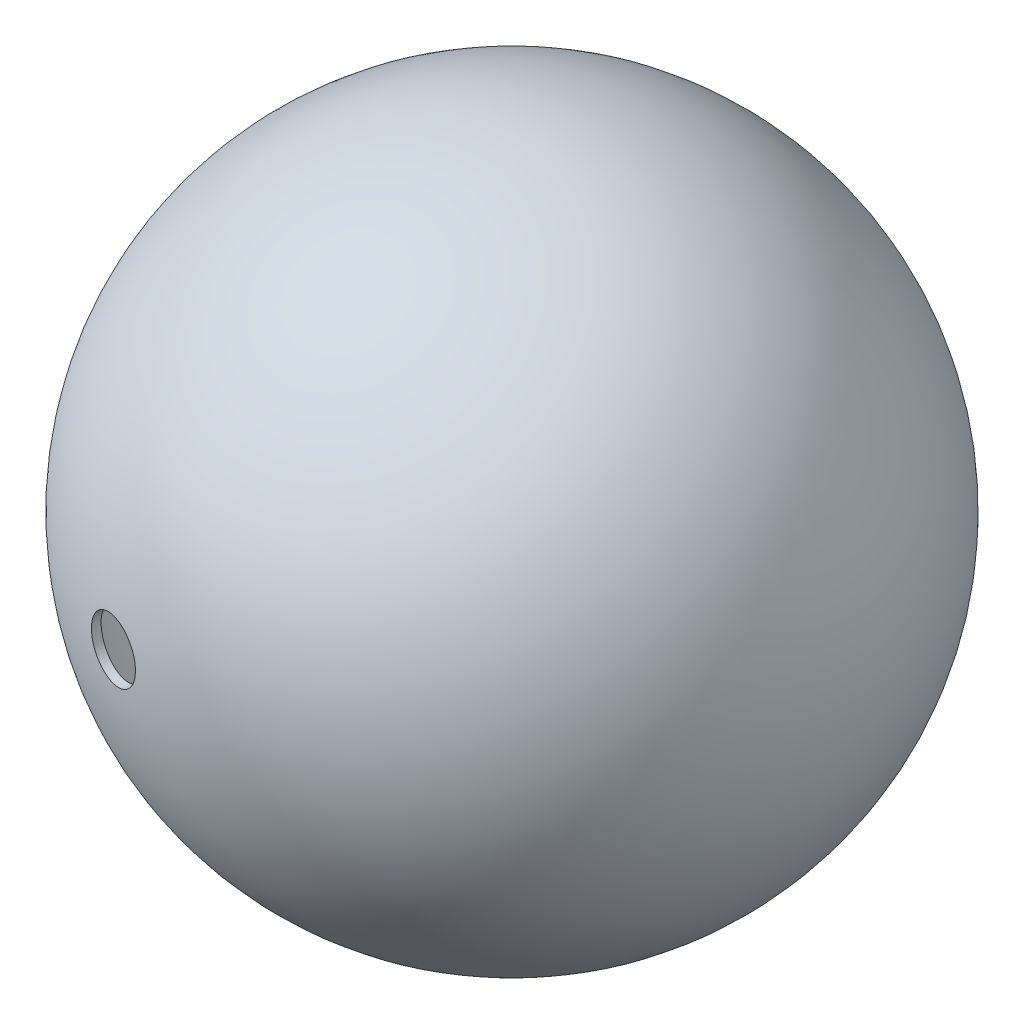
ISO-10303-21;
HEADER;
FILE_DESCRIPTION(('STEP AP214'),'2;1');
FILE_NAME('part.step','',(''),(''),'','','');
FILE_SCHEMA(('AUTOMOTIVE_DESIGN { 1 0 10303 214 1 1 1 1 }'));
ENDSEC;
DATA;
#1=APPLICATION_CONTEXT('core data for automotive mechanical design processes');
#2=APPLICATION_PROTOCOL_DEFINITION('international standard','automotive_design',2000,#1);
#3=PRODUCT_CONTEXT('',#1,'mechanical');
#4=PRODUCT('Part','Part','',(#3));
#5=PRODUCT_RELATED_PRODUCT_CATEGORY('part','',(#4));
#6=PRODUCT_DEFINITION_FORMATION('','',#4);
#7=PRODUCT_DEFINITION_CONTEXT('part definition',#1,'design');
#8=PRODUCT_DEFINITION('design','',#6,#7);
#9=PRODUCT_DEFINITION_SHAPE('','',#8);
#10=(LENGTH_UNIT() NAMED_UNIT(*) SI_UNIT(.MILLI.,.METRE.));
#11=(NAMED_UNIT(*) PLANE_ANGLE_UNIT() SI_UNIT($,.RADIAN.));
#12=(NAMED_UNIT(*) SI_UNIT($,.STERADIAN.) SOLID_ANGLE_UNIT());
#13=UNCERTAINTY_MEASURE_WITH_UNIT(LENGTH_MEASURE(1.E-05),#10,'distance_accuracy_value','');
#14=(GEOMETRIC_REPRESENTATION_CONTEXT(3) GLOBAL_UNCERTAINTY_ASSIGNED_CONTEXT((#13)) GLOBAL_UNIT_ASSIGNED_CONTEXT((#10,
#11,#12)) REPRESENTATION_CONTEXT('',''));
#15=CARTESIAN_POINT('',(0.,0.,0.));
#16=DIRECTION('',(0.,0.,1.));
#17=DIRECTION('',(1.,0.,0.));
#18=AXIS2_PLACEMENT_3D('',#15,#16,#17);
#19=CARTESIAN_POINT('',(0.,0.,0.));
#20=DIRECTION('',(0.,1.,0.));
#21=DIRECTION('',(1.,0.,0.));
#22=AXIS2_PLACEMENT_3D('',#19,#20,#21);
#23=SPHERICAL_SURFACE('',#22,12.33);
#24=CARTESIAN_POINT('',(-3.89423857841952,-0.640575807275164,11.6813299127061));
#25=CARTESIAN_POINT('',(-3.85775168175633,-0.691505855556212,11.6907004718159));
#26=CARTESIAN_POINT('',(-3.81696509159421,-0.739223212932149,11.7011640014424));
#27=CARTESIAN_POINT('',(-3.72811549347727,-0.826894922693143,11.7239215486656));
#28=CARTESIAN_POINT('',(-3.68004101211075,-0.866836803491528,11.7362184520507));
#29=CARTESIAN_POINT('',(-3.57819710896939,-0.937834038809236,11.7622228270749));
#30=CARTESIAN_POINT('',(-3.52443782093705,-0.968904852812223,11.7759277875105));
#31=CARTESIAN_POINT('',(-3.41271713300457,-1.02150731349265,11.8043550893527));
#32=CARTESIAN_POINT('',(-3.35475685131224,-1.04304148783234,11.8190771599794));
#33=CARTESIAN_POINT('',(-3.23492437803613,-1.07645792659961,11.8494552267948));
#34=CARTESIAN_POINT('',(-3.17299487658737,-1.08812275102135,11.8651244962458));
#35=CARTESIAN_POINT('',(-3.04809735110112,-1.1007395624117,11.8966619112228));
#36=CARTESIAN_POINT('',(-2.98512916395858,-1.1016898505239,11.9125300878875));
#37=CARTESIAN_POINT('',(-2.85894917270471,-1.09277803432639,11.9442647516258));
#38=CARTESIAN_POINT('',(-2.79574781632589,-1.08275396486635,11.96012766214));
#39=CARTESIAN_POINT('',(-2.67187161406038,-1.05185862975064,11.9911597111651));
#40=CARTESIAN_POINT('',(-2.61119678222989,-1.03098730375545,12.0063288458163));
#41=CARTESIAN_POINT('',(-2.4944472361188,-0.979019530976722,12.0354654254668));
#42=CARTESIAN_POINT('',(-2.43835175318607,-0.947972868987433,12.0494383116953));
#43=CARTESIAN_POINT('',(-2.33215852169005,-0.876405111618228,12.0758487686261));
#44=CARTESIAN_POINT('',(-2.28206011160448,-0.835885062683024,12.0882865086713));
#45=CARTESIAN_POINT('',(-2.19051068611181,-0.74745383396816,12.110985184453));
#46=CARTESIAN_POINT('',(-2.14889219024592,-0.699726991745772,12.1212883657112));
#47=CARTESIAN_POINT('',(-2.0743040534998,-0.597565732522574,12.1397348007515));
#48=CARTESIAN_POINT('',(-2.04133291737108,-0.543132477549204,12.1478784279533));
#49=CARTESIAN_POINT('',(-1.98600320550661,-0.430828854076708,12.1615346985292));
#50=CARTESIAN_POINT('',(-1.96336075390828,-0.373106866502893,12.167117744494));
#51=CARTESIAN_POINT('',(-1.92806232592623,-0.254510351422112,12.175818049115));
#52=CARTESIAN_POINT('',(-1.91540481518788,-0.19363630981407,12.1789356866231));
#53=CARTESIAN_POINT('',(-1.90069042842959,-0.0719989410932524,12.1825596919018));
#54=CARTESIAN_POINT('',(-1.89839183652547,-0.0112665175828894,12.183125602065));
#55=CARTESIAN_POINT('',(-1.90381222079359,0.109719523717276,12.1817908008469));
#56=CARTESIAN_POINT('',(-1.91153052207379,0.169973173489462,12.1798902556438));
#57=CARTESIAN_POINT('',(-1.93662729615165,0.287820915290548,12.1737071415375));
#58=CARTESIAN_POINT('',(-1.95393183956863,0.3454317515228,12.1694428021302));
#59=CARTESIAN_POINT('',(-1.99758604642471,0.456890520775181,12.1586764300414));
#60=CARTESIAN_POINT('',(-2.02393599979012,0.510738333115102,12.1521743256345));
#61=CARTESIAN_POINT('',(-2.08518808249646,0.613800988661716,12.1370436736015));
#62=CARTESIAN_POINT('',(-2.12018018738811,0.66295901673982,12.1283927482544));
#63=CARTESIAN_POINT('',(-2.19749531071848,0.754709587199057,12.1092534664174));
#64=CARTESIAN_POINT('',(-2.23981913093077,0.79730141055672,12.0987649089684));
#65=CARTESIAN_POINT('',(-2.33169350436811,0.875847118205251,12.0759625649929));
#66=CARTESIAN_POINT('',(-2.3813966112871,0.911611273715355,12.0636101261537));
#67=CARTESIAN_POINT('',(-2.48578246000546,0.974314690876098,12.0376232685963));
#68=CARTESIAN_POINT('',(-2.54046592479811,1.00125266862192,12.0239886637381));
#69=CARTESIAN_POINT('',(-2.65493706198322,1.04633777753928,11.995394432145));
#70=CARTESIAN_POINT('',(-2.714826166912,1.064210506997,11.9804080123852));
#71=CARTESIAN_POINT('',(-2.83662519023071,1.08957781020603,11.9498695396523));
#72=CARTESIAN_POINT('',(-2.89853537209928,1.09707102525228,11.9343174129001));
#73=CARTESIAN_POINT('',(-3.0240109672061,1.1015655112816,11.9027345027742));
#74=CARTESIAN_POINT('',(-3.08758373787051,1.09834201062414,11.8867005446218));
#75=CARTESIAN_POINT('',(-3.21330230247774,1.08098531466911,11.8549288754347));
#76=CARTESIAN_POINT('',(-3.27544801462931,1.06685149565048,11.8391911813895));
#77=CARTESIAN_POINT('',(-3.39678914828294,1.02792707492006,11.8084039193739));
#78=CARTESIAN_POINT('',(-3.45597158942173,1.00309350739992,11.793357399366));
#79=CARTESIAN_POINT('',(-3.56935360770841,0.94336693150768,11.764479887607));
#80=CARTESIAN_POINT('',(-3.62355347135851,0.908474502006026,11.7506488259681));
#81=CARTESIAN_POINT('',(-3.7244656393364,0.830158733273977,11.7248569343794));
#82=CARTESIAN_POINT('',(-3.77128351850179,0.786880233027356,11.7128698085625));
#83=CARTESIAN_POINT('',(-3.85694498529733,0.69260344044194,11.6909089026003));
#84=CARTESIAN_POINT('',(-3.8957898926853,0.641606428172513,11.6809347892478));
#85=CARTESIAN_POINT('',(-3.96316869169015,0.534946377306921,11.6636169741754));
#86=CARTESIAN_POINT('',(-3.9919729189442,0.479465333574898,11.6562043640814));
#87=CARTESIAN_POINT('',(-4.03983487679804,0.364191635903038,11.6438794654926));
#88=CARTESIAN_POINT('',(-4.05889484495732,0.30439997540504,11.6389666029858));
#89=CARTESIAN_POINT('',(-4.08618773235738,0.184091617850248,11.6319295782436));
#90=CARTESIAN_POINT('',(-4.09472192469567,0.123647670689082,11.6297278208508));
#91=CARTESIAN_POINT('',(-4.10167983764615,0.00212712013117659,11.6279328279403));
#92=CARTESIAN_POINT('',(-4.10010198990579,-0.0589495799372979,11.6283399970607));
#93=CARTESIAN_POINT('',(-4.08698674491201,-0.179049488812694,11.631723098003));
#94=CARTESIAN_POINT('',(-4.07559287419262,-0.238089596578929,11.6346620114797));
#95=CARTESIAN_POINT('',(-4.0434245312293,-0.353319949508063,11.6429536562815));
#96=CARTESIAN_POINT('',(-4.02266188735208,-0.409513689101712,11.6483033439182));
#97=CARTESIAN_POINT('',(-3.98311736873325,-0.494632619196736,11.6584822938749));
#98=CARTESIAN_POINT('',(-3.96722259597301,-0.525024790432751,11.6625719301515));
#99=CARTESIAN_POINT('',(-3.93272353188613,-0.584121147319811,11.6714428652333));
#100=CARTESIAN_POINT('',(-3.91411931667609,-0.612825380358452,11.6762241446081));
#101=CARTESIAN_POINT('',(-3.89423857841952,-0.640575807275164,11.6813299127061));
#102=B_SPLINE_CURVE_WITH_KNOTS('',3,(#24,#25,#26,#27,#28,#29,#30,#31,#32,#33,#34,#35,#36,#37,
#38,#39,#40,#41,#42,#43,#44,#45,#46,#47,#48,#49,#50,#51,#52,#53,#54,#55,#56,#57,#58,#59,#60,#61,
#62,#63,#64,#65,#66,#67,#68,#69,#70,#71,#72,#73,#74,#75,#76,#77,#78,#79,#80,#81,#82,#83,#84,#85,
#86,#87,#88,#89,#90,#91,#92,#93,#94,#95,#96,#97,#98,#99,#100,#101),.UNSPECIFIED.,.T.,.F.,(4,2,2,
2,2,2,2,2,2,2,2,2,2,2,2,2,2,2,2,2,2,2,2,2,2,2,2,2,2,2,2,2,2,2,2,2,2,2,4),(0.,0.189913425448115,
0.380128999789478,0.57001103608797,0.759842714467535,0.953755231429849,1.14769849399646,
1.34454313137859,1.54138886375081,1.73728551987691,1.93316054717614,2.1246810849295,
2.31616848425834,2.5020180834332,2.68783911811498,2.86930095235598,3.05075056117062,
3.23081992316923,3.41089505734623,3.59293047056877,3.77498580319878,3.96153346287635,
4.14810824677695,4.34003620855183,4.5319892918157,4.72799357199572,4.92400905817813,
5.12081910746094,5.31761783291959,5.51127977672094,5.70490963796116,5.89282825245518,
6.08070369607811,6.26306658427347,6.44545775718859,6.62522647431475,6.80476886015796,
6.90825053438461,7.01172930205272),.UNSPECIFIED.);
#103=CARTESIAN_POINT('',(-3.89423857841952,-0.640575807275164,11.6813299127061));
#104=VERTEX_POINT('',#103);
#105=EDGE_CURVE('E10',#104,#104,#102,.T.);
#106=ORIENTED_EDGE('',*,*,#105,.F.);
#107=EDGE_LOOP('',(#106));
#108=FACE_BOUND('',#107,.T.);
#109=CARTESIAN_POINT('',(0.,0.,-11.9650387931034));
#110=DIRECTION('',(0.,0.,-1.));
#111=DIRECTION('',(-1.,0.,0.));
#112=AXIS2_PLACEMENT_3D('',#109,#110,#111);
#113=CIRCLE('',#112,2.9777082932231);
#114=CARTESIAN_POINT('',(2.97770829322309,0.,-11.9650387931034));
#115=VERTEX_POINT('',#114);
#116=EDGE_CURVE('E46',#115,#115,#113,.T.);
#117=ORIENTED_EDGE('',*,*,#116,.F.);
#118=EDGE_LOOP('',(#117));
#119=FACE_BOUND('',#118,.T.);
#120=ADVANCED_FACE('F33',(#108,#119),#23,.T.);
#121=CARTESIAN_POINT('',(0.,0.,0.));
#122=DIRECTION('',(0.,1.,0.));
#123=DIRECTION('',(1.,0.,0.));
#124=AXIS2_PLACEMENT_3D('',#121,#122,#123);
#125=SPHERICAL_SURFACE('',#124,11.99);
#126=CARTESIAN_POINT('',(-3.95136058227673,-0.552189317616778,11.3067208555947));
#127=CARTESIAN_POINT('',(-3.92007006963208,-0.606093087319684,11.3150231329755));
#128=CARTESIAN_POINT('',(-3.88423802164864,-0.657240591148591,11.3245213102823));
#129=CARTESIAN_POINT('',(-3.8046783739078,-0.75256841648249,11.3455780125305));
#130=CARTESIAN_POINT('',(-3.76093829258161,-0.796737514159434,11.3571397941678));
#131=CARTESIAN_POINT('',(-3.66703639502787,-0.876847951739898,11.3819169969643));
#132=CARTESIAN_POINT('',(-3.61688677865954,-0.912804569935177,11.3951292755283));
#133=CARTESIAN_POINT('',(-3.51158198788507,-0.975728787554527,11.4228192475459));
#134=CARTESIAN_POINT('',(-3.45642809601233,-1.00269868193103,11.4372966167374));
#135=CARTESIAN_POINT('',(-3.34124062454943,-1.04760050331811,11.4674709103668));
#136=CARTESIAN_POINT('',(-3.28112143498747,-1.06529874869775,11.4831888276857));
#137=CARTESIAN_POINT('',(-3.15886602784906,-1.09025478415775,11.5150839433738));
#138=CARTESIAN_POINT('',(-3.09672944398037,-1.09751066728654,11.5312612250808));
#139=CARTESIAN_POINT('',(-2.97081068101053,-1.10145273022891,11.5639746172238));
#140=CARTESIAN_POINT('',(-2.90702140670561,-1.09791307165853,11.5805111089258));
#141=CARTESIAN_POINT('',(-2.78089818541203,-1.07983939798418,11.6131381273939));
#142=CARTESIAN_POINT('',(-2.71856429950102,-1.06530492231744,11.6292286354489));
#143=CARTESIAN_POINT('',(-2.59707860147303,-1.02554547056807,11.6605263050606));
#144=CARTESIAN_POINT('',(-2.537930516673,-1.00030826611846,11.6757324335034));
#145=CARTESIAN_POINT('',(-2.42467599062205,-0.939747078835163,11.7047962585116));
#146=CARTESIAN_POINT('',(-2.37056912714535,-0.904423941754389,11.7186540680093));
#147=CARTESIAN_POINT('',(-2.27007810948992,-0.825362623719269,11.7443515623026));
#148=CARTESIAN_POINT('',(-2.22356668947404,-0.781797195528924,11.7562246064173));
#149=CARTESIAN_POINT('',(-2.13855862553192,-0.687000447767173,11.7778973493299));
#150=CARTESIAN_POINT('',(-2.10006059764951,-0.635770454538776,11.7876974061487));
#151=CARTESIAN_POINT('',(-2.03343087931812,-0.528767938142816,11.8046425016905));
#152=CARTESIAN_POINT('',(-2.00501965541982,-0.473180828867069,11.8118591897618));
#153=CARTESIAN_POINT('',(-1.95794447148124,-0.35777335301735,11.8238094169681));
#154=CARTESIAN_POINT('',(-1.93927876715179,-0.29795374616937,11.8285434004675));
#155=CARTESIAN_POINT('',(-1.91273011621139,-0.177585073089124,11.8352748333832));
#156=CARTESIAN_POINT('',(-1.9045598962234,-0.117103326132756,11.8373451917913));
#157=CARTESIAN_POINT('',(-1.89832834082966,0.00440948727145455,11.8389243869402));
#158=CARTESIAN_POINT('',(-1.9002659825601,0.0654404975127243,11.8384334828677));
#159=CARTESIAN_POINT('',(-1.91408630331005,0.185447383369671,11.8349307177107));
#160=CARTESIAN_POINT('',(-1.92583385585512,0.244439901233851,11.8319531096446));
#161=CARTESIAN_POINT('',(-1.95870618739566,0.359571002139497,11.8236153571741));
#162=CARTESIAN_POINT('',(-1.97983100938861,0.41570957209347,11.8182552018449));
#163=CARTESIAN_POINT('',(-2.03093056585431,0.523934308119346,11.8052767334101));
#164=CARTESIAN_POINT('',(-2.06095792140453,0.575993983617921,11.7976449923314));
#165=CARTESIAN_POINT('',(-2.12887448215882,0.674323285325342,11.7803619455448));
#166=CARTESIAN_POINT('',(-2.16676443604278,0.720592359477629,11.7707104475141));
#167=CARTESIAN_POINT('',(-2.25022077455481,0.807172670156223,11.7494208768963));
#168=CARTESIAN_POINT('',(-2.29594193906558,0.847324755179683,11.7377426695921));
#169=CARTESIAN_POINT('',(-2.39309229671555,0.919414831035466,11.7128860890259));
#170=CARTESIAN_POINT('',(-2.44452232746755,0.951351614220796,11.6997074956179));
#171=CARTESIAN_POINT('',(-2.55329451164522,1.00712539890945,11.6717836439493));
#172=CARTESIAN_POINT('',(-2.61076871691144,1.03068718213538,11.6570029786318));
#173=CARTESIAN_POINT('',(-2.72865827630605,1.06779877282052,11.6266238025337));
#174=CARTESIAN_POINT('',(-2.78907406686747,1.08134708976136,11.6110251703676));
#175=CARTESIAN_POINT('',(-2.9128066837522,1.09836101784881,11.5790121549413));
#176=CARTESIAN_POINT('',(-2.97615810616853,1.10155578399867,11.5625871070558));
#177=CARTESIAN_POINT('',(-3.10248180661712,1.09703825862355,11.5297648963618));
#178=CARTESIAN_POINT('',(-3.16545405006725,1.0893249869455,11.5133677361918));
#179=CARTESIAN_POINT('',(-3.2899102647017,1.06303273478237,11.4808930314656));
#180=CARTESIAN_POINT('',(-3.35137193433293,1.04434153758964,11.4648205873668));
#181=CARTESIAN_POINT('',(-3.47032479225684,0.996446175410824,11.4336518351617));
#182=CARTESIAN_POINT('',(-3.52781606301422,0.967242228851597,11.418555506782));
#183=CARTESIAN_POINT('',(-3.63648499832363,0.899413477874769,11.3899689365462));
#184=CARTESIAN_POINT('',(-3.68772434043957,0.860894214522903,11.3764630602257));
#185=CARTESIAN_POINT('',(-3.78298167180451,0.775267093569932,11.351315710672));
#186=CARTESIAN_POINT('',(-3.82700074243292,0.728160524324276,11.3396739582553));
#187=CARTESIAN_POINT('',(-3.9052076033121,0.628105506150249,11.3189645691928));
#188=CARTESIAN_POINT('',(-3.93963869343792,0.575360491248587,11.309833322968));
#189=CARTESIAN_POINT('',(-3.99910594065723,0.464480479751559,11.2940482995498));
#190=CARTESIAN_POINT('',(-4.02414443339751,0.406346827632752,11.2873939064433));
#191=CARTESIAN_POINT('',(-4.06327547004254,0.288406657523373,11.276988672681));
#192=CARTESIAN_POINT('',(-4.07770189306788,0.22871860999623,11.2731492800628));
#193=CARTESIAN_POINT('',(-4.09643164587365,0.107649275597538,11.2681638479551));
#194=CARTESIAN_POINT('',(-4.10073377461714,0.046267788708378,11.2670181280139));
#195=CARTESIAN_POINT('',(-4.09907831624573,-0.075047915217699,11.2674588997241));
#196=CARTESIAN_POINT('',(-4.09333375846744,-0.134985514691149,11.268988660659));
#197=CARTESIAN_POINT('',(-4.07219264708447,-0.252951857043323,11.2746153807927));
#198=CARTESIAN_POINT('',(-4.05680873775026,-0.310982995907005,11.278708976917));
#199=CARTESIAN_POINT('',(-4.02550436768047,-0.399383702321012,11.2870316129476));
#200=CARTESIAN_POINT('',(-4.01263994872038,-0.430948683819796,11.290450594328));
#201=CARTESIAN_POINT('',(-3.98408587743288,-0.492677850648538,11.2980351913969));
#202=CARTESIAN_POINT('',(-3.96839631327502,-0.522842079657431,11.3022007837845));
#203=CARTESIAN_POINT('',(-3.95136058227673,-0.552189317616778,11.3067208555947));
#204=B_SPLINE_CURVE_WITH_KNOTS('',3,(#126,#127,#128,#129,#130,#131,#132,#133,#134,#135,#136,
#137,#138,#139,#140,#141,#142,#143,#144,#145,#146,#147,#148,#149,#150,#151,#152,#153,#154,#155,
#156,#157,#158,#159,#160,#161,#162,#163,#164,#165,#166,#167,#168,#169,#170,#171,#172,#173,#174,
#175,#176,#177,#178,#179,#180,#181,#182,#183,#184,#185,#186,#187,#188,#189,#190,#191,#192,#193,
#194,#195,#196,#197,#198,#199,#200,#201,#202,#203),.UNSPECIFIED.,.T.,.F.,(4,2,2,2,2,2,2,2,2,2,2,
2,2,2,2,2,2,2,2,2,2,2,2,2,2,2,2,2,2,2,2,2,2,2,2,2,2,2,4),(0.,0.188503977465546,
0.377308117832125,0.565758097559767,0.754159915599789,0.947105902832931,1.14008712079054,
1.33713291849562,1.53418697072495,1.73146677556009,1.9287300424109,2.12224297672385,
2.31572246252578,2.50332077153593,2.69088549198584,2.87319859147564,3.05549324217181,
3.23531751839425,3.41514261917158,3.59605257209164,3.77697975924403,3.96201548871129,
4.14707840285348,4.33775746417944,4.52846490263534,4.72412253069714,4.91979774089525,
5.11750884339824,5.31521583822966,5.51077993820477,5.70631472176505,5.89630710195313,
6.08625220557836,6.2699305570305,6.45363069700076,6.63348274724932,6.81309937181975,
6.91573122370195,7.01835987311655),.UNSPECIFIED.);
#205=CARTESIAN_POINT('',(-3.95136058227673,-0.552189317616778,11.3067208555947));
#206=VERTEX_POINT('',#205);
#207=EDGE_CURVE('E41',#206,#206,#204,.T.);
#208=ORIENTED_EDGE('',*,*,#207,.T.);
#209=EDGE_LOOP('',(#208));
#210=FACE_BOUND('',#209,.T.);
#211=CARTESIAN_POINT('',(0.,0.,-11.608625));
#212=DIRECTION('',(0.,0.,-1.));
#213=DIRECTION('',(-1.,0.,0.));
#214=AXIS2_PLACEMENT_3D('',#211,#212,#213);
#215=CIRCLE('',#214,2.99998760153688);
#216=CARTESIAN_POINT('',(2.99998760153688,0.,-11.608625));
#217=VERTEX_POINT('',#216);
#218=EDGE_CURVE('E37',#217,#217,#215,.T.);
#219=ORIENTED_EDGE('',*,*,#218,.T.);
#220=EDGE_LOOP('',(#219));
#221=FACE_BOUND('',#220,.T.);
#222=ADVANCED_FACE('F58',(#210,#221),#125,.F.);
#223=CARTESIAN_POINT('',(-3.,0.,100.));
#224=DIRECTION('',(0.,0.,-1.));
#225=DIRECTION('',(-1.,0.,0.));
#226=AXIS2_PLACEMENT_3D('',#223,#224,#225);
#227=CYLINDRICAL_SURFACE('',#226,1.1);
#228=ORIENTED_EDGE('',*,*,#207,.F.);
#229=EDGE_LOOP('',(#228));
#230=FACE_BOUND('',#229,.T.);
#231=ORIENTED_EDGE('',*,*,#105,.T.);
#232=EDGE_LOOP('',(#231));
#233=FACE_BOUND('',#232,.T.);
#234=ADVANCED_FACE('F53',(#230,#233),#227,.F.);
#235=CARTESIAN_POINT('',(0.,0.,-11.6));
#236=DIRECTION('',(0.,0.,-1.));
#237=DIRECTION('',(1.,0.,0.));
#238=AXIS2_PLACEMENT_3D('',#235,#236,#237);
#239=SPHERICAL_SURFACE('',#238,3.);
#240=CARTESIAN_POINT('',(2.99998760153688,0.,-11.608625));
#241=CARTESIAN_POINT('',(2.99997690056302,0.,-11.6123470744694));
#242=CARTESIAN_POINT('',(2.99995927257366,0.,-11.6160691290233));
#243=CARTESIAN_POINT('',(2.99991016295956,0.,-11.623513146736));
#244=CARTESIAN_POINT('',(2.9998786813348,0.,-11.6272351098949));
#245=CARTESIAN_POINT('',(2.99980186484548,0.,-11.6346788932534));
#246=CARTESIAN_POINT('',(2.99975652998091,0.,-11.6384007134531));
#247=CARTESIAN_POINT('',(2.9996520076509,0.,-11.6458441593315));
#248=CARTESIAN_POINT('',(2.99959282018545,0.,-11.6495657850102));
#249=CARTESIAN_POINT('',(2.99946059347075,0.,-11.6570087902875));
#250=CARTESIAN_POINT('',(2.99938755422149,0.,-11.660730169886));
#251=CARTESIAN_POINT('',(2.99922762495182,0.,-11.6681726314473));
#252=CARTESIAN_POINT('',(2.99914073493141,0.,-11.67189371341));
#253=CARTESIAN_POINT('',(2.998953105323,0.,-11.6793355281478));
#254=CARTESIAN_POINT('',(2.998852365735,0.,-11.6830562609229));
#255=CARTESIAN_POINT('',(2.9986370383871,0.,-11.6904973257388));
#256=CARTESIAN_POINT('',(2.9985224506272,0.,-11.6942176577797));
#257=CARTESIAN_POINT('',(2.99827942852299,0.,-11.7016578695857));
#258=CARTESIAN_POINT('',(2.99815099417868,0.,-11.7053777493509));
#259=CARTESIAN_POINT('',(2.99788028068496,0.,-11.7128170050708));
#260=CARTESIAN_POINT('',(2.99773800153555,0.,-11.7165363810255));
#261=CARTESIAN_POINT('',(2.99743960040276,0.,-11.7239745775963));
#262=CARTESIAN_POINT('',(2.99728347841939,0.,-11.7276933982124));
#263=CARTESIAN_POINT('',(2.99695739378157,0.,-11.7351304325858));
#264=CARTESIAN_POINT('',(2.99678743112713,0.,-11.7388486463431));
#265=CARTESIAN_POINT('',(2.99643366750184,0.,-11.7462844154868));
#266=CARTESIAN_POINT('',(2.99624986653099,0.,-11.7500019708733));
#267=CARTESIAN_POINT('',(2.99586842881924,0.,-11.7574363717728));
#268=CARTESIAN_POINT('',(2.99567079207835,0.,-11.7611532172858));
#269=CARTESIAN_POINT('',(2.99526168556456,0.,-11.7685861469452));
#270=CARTESIAN_POINT('',(2.99505021579166,0.,-11.7723022310917));
#271=CARTESIAN_POINT('',(2.99461344614357,0.,-11.7797335865358));
#272=CARTESIAN_POINT('',(2.99438814626836,0.,-11.7834488578334));
#273=CARTESIAN_POINT('',(2.99392371953694,0.,-11.7908785361086));
#274=CARTESIAN_POINT('',(2.99368459268072,0.,-11.7945929430862));
#275=CARTESIAN_POINT('',(2.9931925153001,0.,-11.8020208412622));
#276=CARTESIAN_POINT('',(2.99293956477571,0.,-11.8057343324606));
#277=CARTESIAN_POINT('',(2.99241984356312,0.,-11.8131603476319));
#278=CARTESIAN_POINT('',(2.99215307287492,0.,-11.8168728716046));
#279=CARTESIAN_POINT('',(2.99160571503053,0.,-11.8242969008915));
#280=CARTESIAN_POINT('',(2.99132512787434,0.,-11.8280084062056));
#281=CARTESIAN_POINT('',(2.99075014098122,0.,-11.835430346756));
#282=CARTESIAN_POINT('',(2.99045574124429,0.,-11.8391407819924));
#283=CARTESIAN_POINT('',(2.98985313326826,0.,-11.8465605309834));
#284=CARTESIAN_POINT('',(2.98954492502917,0.,-11.850269844738));
#285=CARTESIAN_POINT('',(2.98891470431874,0.,-11.8576872993767));
#286=CARTESIAN_POINT('',(2.9885926918474,0.,-11.8613954402609));
#287=CARTESIAN_POINT('',(2.98793486713359,0.,-11.8688104977865));
#288=CARTESIAN_POINT('',(2.98759905489113,0.,-11.8725174144279));
#289=CARTESIAN_POINT('',(2.98691363528742,0.,-11.8799299721126));
#290=CARTESIAN_POINT('',(2.98656402792616,0.,-11.8836356131559));
#291=CARTESIAN_POINT('',(2.98585102292831,0.,-11.8910455683065));
#292=CARTESIAN_POINT('',(2.98548762529171,0.,-11.8947498824139));
#293=CARTESIAN_POINT('',(2.9847470447776,0.,-11.9021571323735));
#294=CARTESIAN_POINT('',(2.98436986190008,0.,-11.9058600682257));
#295=CARTESIAN_POINT('',(2.98360171612983,0.,-11.9132645103747));
#296=CARTESIAN_POINT('',(2.98321075323708,0.,-11.9169660166715));
#297=CARTESIAN_POINT('',(2.98241505285195,0.,-11.9243675484291));
#298=CARTESIAN_POINT('',(2.98201031535957,0.,-11.9280675738899));
#299=CARTESIAN_POINT('',(2.98118707138526,0.,-11.9354660927161));
#300=CARTESIAN_POINT('',(2.98076856490335,0.,-11.9391645860814));
#301=CARTESIAN_POINT('',(2.97991778873714,0.,-11.9465599894765));
#302=CARTESIAN_POINT('',(2.97948551905286,0.,-11.9502568995063));
#303=CARTESIAN_POINT('',(2.97860722251083,0.,-11.9576490850185));
#304=CARTESIAN_POINT('',(2.9781611956531,0.,-11.9613443605008));
#305=CARTESIAN_POINT('',(2.97770829322309,0.,-11.9650387931034));
#306=B_SPLINE_CURVE_WITH_KNOTS('',3,(#240,#241,#242,#243,#244,#245,#246,#247,#248,#249,#250,
#251,#252,#253,#254,#255,#256,#257,#258,#259,#260,#261,#262,#263,#264,#265,#266,#267,#268,#269,
#270,#271,#272,#273,#274,#275,#276,#277,#278,#279,#280,#281,#282,#283,#284,#285,#286,#287,#288,
#289,#290,#291,#292,#293,#294,#295,#296,#297,#298,#299,#300,#301,#302,#303,#304,#305),
.UNSPECIFIED.,.F.,.F.,(4,2,2,2,2,2,2,2,2,2,2,2,2,2,2,2,2,2,2,2,2,2,2,2,2,2,2,2,2,2,2,2,4),(0.,
0.0111662631099486,0.0223325262198939,0.0334987893298423,0.0446650524397878,0.0558313155497358,
0.0669975786596815,0.0781638417696291,0.0893301048795755,0.100496367989523,0.11166263109947,
0.122828894209418,0.133995157319363,0.14516142042931,0.156327683539257,0.167493946649204,
0.178660209759151,0.189826472869098,0.200992735979045,0.212158999088992,0.223325262198939,
0.234491525308887,0.245657788418832,0.25682405152878,0.267990314638727,0.279156577748674,
0.290322840858621,0.301489103968567,0.312655367078513,0.323821630188461,0.334987893298408,
0.346154156408356,0.357320419518303),.UNSPECIFIED.);
#307=EDGE_CURVE('BSEAM57',#217,#115,#306,.T.);
#308=ORIENTED_EDGE('',*,*,#218,.F.);
#309=ORIENTED_EDGE('',*,*,#116,.T.);
#310=ORIENTED_EDGE('',*,*,#307,.T.);
#311=ORIENTED_EDGE('',*,*,#307,.F.);
#312=EDGE_LOOP('',(#308,#310,#309,#311));
#313=FACE_BOUND('',#312,.T.);
#314=ADVANCED_FACE('F57',(#313),#239,.F.);
#315=CLOSED_SHELL('',(#120,#222,#234,#314));
#316=MANIFOLD_SOLID_BREP('B2',#315);
#317=ADVANCED_BREP_SHAPE_REPRESENTATION('',(#18,#316),#14);
#318=SHAPE_DEFINITION_REPRESENTATION(#9,#317);
ENDSEC;
END-ISO-10303-21;
